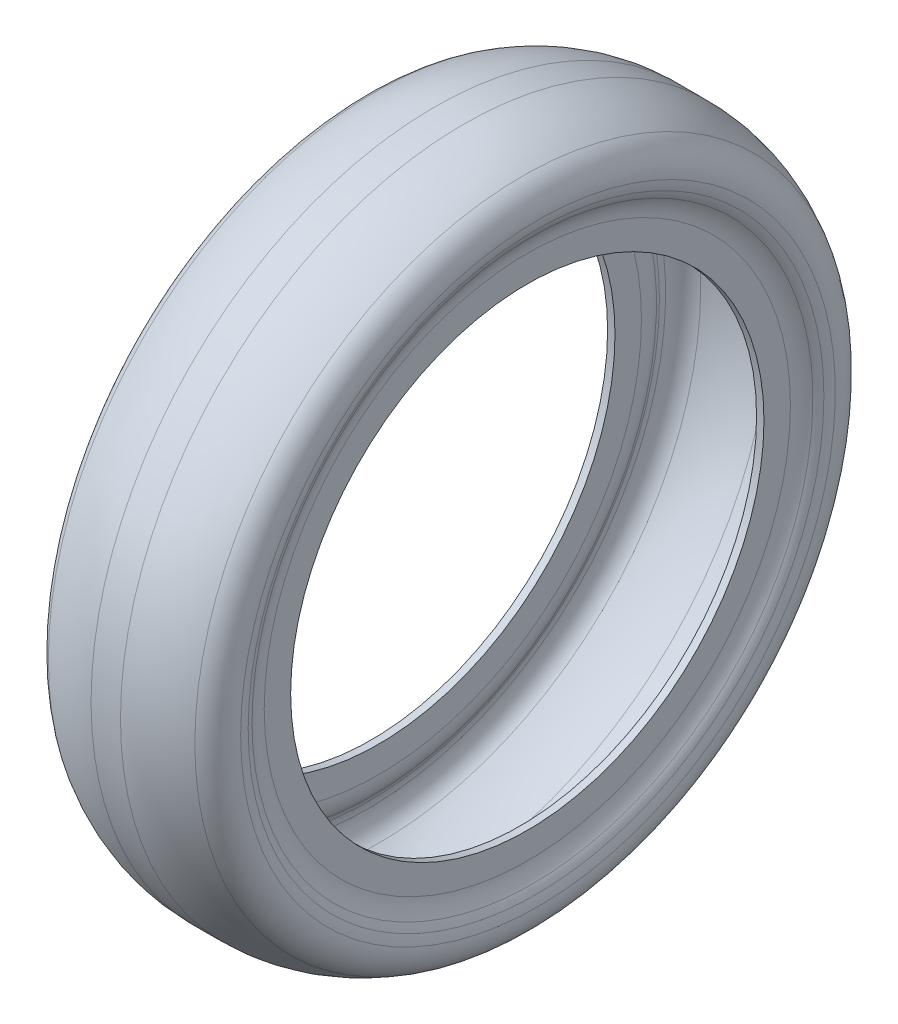
ISO-10303-21;
HEADER;
FILE_DESCRIPTION(('STEP AP214'),'2;1');
FILE_NAME('part.step','',(''),(''),'','','');
FILE_SCHEMA(('AUTOMOTIVE_DESIGN { 1 0 10303 214 1 1 1 1 }'));
ENDSEC;
DATA;
#1=APPLICATION_CONTEXT('core data for automotive mechanical design processes');
#2=APPLICATION_PROTOCOL_DEFINITION('international standard','automotive_design',2000,#1);
#3=PRODUCT_CONTEXT('',#1,'mechanical');
#4=PRODUCT('Part','Part','',(#3));
#5=PRODUCT_RELATED_PRODUCT_CATEGORY('part','',(#4));
#6=PRODUCT_DEFINITION_FORMATION('','',#4);
#7=PRODUCT_DEFINITION_CONTEXT('part definition',#1,'design');
#8=PRODUCT_DEFINITION('design','',#6,#7);
#9=PRODUCT_DEFINITION_SHAPE('','',#8);
#10=(LENGTH_UNIT() NAMED_UNIT(*) SI_UNIT(.MILLI.,.METRE.));
#11=(NAMED_UNIT(*) PLANE_ANGLE_UNIT() SI_UNIT($,.RADIAN.));
#12=(NAMED_UNIT(*) SI_UNIT($,.STERADIAN.) SOLID_ANGLE_UNIT());
#13=UNCERTAINTY_MEASURE_WITH_UNIT(LENGTH_MEASURE(1.E-05),#10,'distance_accuracy_value','');
#14=(GEOMETRIC_REPRESENTATION_CONTEXT(3) GLOBAL_UNCERTAINTY_ASSIGNED_CONTEXT((#13)) GLOBAL_UNIT_ASSIGNED_CONTEXT((#10,
#11,#12)) REPRESENTATION_CONTEXT('',''));
#15=CARTESIAN_POINT('',(0.,0.,0.));
#16=DIRECTION('',(0.,0.,1.));
#17=DIRECTION('',(1.,0.,0.));
#18=AXIS2_PLACEMENT_3D('',#15,#16,#17);
#19=CARTESIAN_POINT('',(47.1399999999994,224.,0.));
#20=DIRECTION('',(1.,0.,0.));
#21=DIRECTION('',(0.,0.,-1.));
#22=AXIS2_PLACEMENT_3D('',#19,#20,#21);
#23=PLANE('',#22);
#24=CARTESIAN_POINT('',(47.1399999999994,0.,0.));
#25=DIRECTION('',(-1.,0.,0.));
#26=DIRECTION('',(0.,0.,1.));
#27=AXIS2_PLACEMENT_3D('',#24,#25,#26);
#28=CIRCLE('',#27,224.);
#29=CARTESIAN_POINT('',(47.1399999999994,0.,224.));
#30=VERTEX_POINT('',#29);
#31=EDGE_CURVE('E10',#30,#30,#28,.T.);
#32=ORIENTED_EDGE('',*,*,#31,.F.);
#33=EDGE_LOOP('',(#32));
#34=FACE_BOUND('',#33,.T.);
#35=CARTESIAN_POINT('',(47.1399999999994,0.,0.));
#36=DIRECTION('',(-1.,0.,0.));
#37=DIRECTION('',(0.,0.,1.));
#38=AXIS2_PLACEMENT_3D('',#35,#36,#37);
#39=CIRCLE('',#38,249.04926879619);
#40=CARTESIAN_POINT('',(47.1399999999994,0.,249.04926879619));
#41=VERTEX_POINT('',#40);
#42=EDGE_CURVE('E119',#41,#41,#39,.T.);
#43=ORIENTED_EDGE('',*,*,#42,.T.);
#44=EDGE_LOOP('',(#43));
#45=FACE_BOUND('',#44,.T.);
#46=ADVANCED_FACE('F31',(#34,#45),#23,.F.);
#47=CARTESIAN_POINT('',(130.136206896551,0.,0.));
#48=DIRECTION('',(-1.,0.,0.));
#49=DIRECTION('',(0.,0.,1.));
#50=AXIS2_PLACEMENT_3D('',#47,#48,#49);
#51=CYLINDRICAL_SURFACE('',#50,224.);
#52=ORIENTED_EDGE('',*,*,#31,.T.);
#53=EDGE_LOOP('',(#52));
#54=FACE_BOUND('',#53,.T.);
#55=CARTESIAN_POINT('',(54.1399999999994,0.,0.));
#56=DIRECTION('',(-1.,0.,0.));
#57=DIRECTION('',(0.,0.,1.));
#58=AXIS2_PLACEMENT_3D('',#55,#56,#57);
#59=CIRCLE('',#58,224.);
#60=CARTESIAN_POINT('',(54.1399999999994,0.,224.));
#61=VERTEX_POINT('',#60);
#62=EDGE_CURVE('E37',#61,#61,#59,.T.);
#63=ORIENTED_EDGE('',*,*,#62,.F.);
#64=EDGE_LOOP('',(#63));
#65=FACE_BOUND('',#64,.T.);
#66=ADVANCED_FACE('F208',(#54,#65),#51,.F.);
#67=CARTESIAN_POINT('',(54.1399999999994,224.,0.));
#68=DIRECTION('',(1.,0.,0.));
#69=DIRECTION('',(0.,0.,-1.));
#70=AXIS2_PLACEMENT_3D('',#67,#68,#69);
#71=PLANE('',#70);
#72=ORIENTED_EDGE('',*,*,#62,.T.);
#73=EDGE_LOOP('',(#72));
#74=FACE_BOUND('',#73,.T.);
#75=CARTESIAN_POINT('',(54.1399999999994,0.,0.));
#76=DIRECTION('',(-1.,0.,0.));
#77=DIRECTION('',(0.,0.,1.));
#78=AXIS2_PLACEMENT_3D('',#75,#76,#77);
#79=CIRCLE('',#78,249.04926879619);
#80=CARTESIAN_POINT('',(54.1399999999994,0.,249.04926879619));
#81=VERTEX_POINT('',#80);
#82=EDGE_CURVE('E41',#81,#81,#79,.T.);
#83=ORIENTED_EDGE('',*,*,#82,.F.);
#84=EDGE_LOOP('',(#83));
#85=FACE_BOUND('',#84,.T.);
#86=ADVANCED_FACE('F213',(#74,#85),#71,.T.);
#87=CARTESIAN_POINT('',(17.1399999999994,0.,0.));
#88=DIRECTION('',(-1.,0.,0.));
#89=DIRECTION('',(0.,0.,1.));
#90=AXIS2_PLACEMENT_3D('',#87,#88,#89);
#91=TOROIDAL_SURFACE('',#90,249.04926879619,37.);
#92=ORIENTED_EDGE('',*,*,#82,.T.);
#93=EDGE_LOOP('',(#92));
#94=FACE_BOUND('',#93,.T.);
#95=CARTESIAN_POINT('',(48.1154632074925,0.,0.));
#96=DIRECTION('',(-1.,0.,0.));
#97=DIRECTION('',(0.,0.,1.));
#98=AXIS2_PLACEMENT_3D('',#95,#96,#97);
#99=CIRCLE('',#98,269.285886079749);
#100=CARTESIAN_POINT('',(48.1154632074925,0.,269.285886079749));
#101=VERTEX_POINT('',#100);
#102=EDGE_CURVE('E45',#101,#101,#99,.T.);
#103=ORIENTED_EDGE('',*,*,#102,.F.);
#104=EDGE_LOOP('',(#103));
#105=FACE_BOUND('',#104,.T.);
#106=ADVANCED_FACE('F217',(#94,#105),#91,.T.);
#107=CARTESIAN_POINT('',(67.3704808770153,0.,0.));
#108=DIRECTION('',(-1.,0.,0.));
#109=DIRECTION('',(0.,0.,1.));
#110=AXIS2_PLACEMENT_3D('',#107,#108,#109);
#111=TOROIDAL_SURFACE('',#110,281.865404931691,23.);
#112=ORIENTED_EDGE('',*,*,#102,.T.);
#113=EDGE_LOOP('',(#112));
#114=FACE_BOUND('',#113,.T.);
#115=CARTESIAN_POINT('',(45.529644817505,0.,0.));
#116=DIRECTION('',(-1.,0.,0.));
#117=DIRECTION('',(0.,0.,1.));
#118=AXIS2_PLACEMENT_3D('',#115,#116,#117);
#119=CIRCLE('',#118,274.65583627458);
#120=CARTESIAN_POINT('',(45.529644817505,0.,274.65583627458));
#121=VERTEX_POINT('',#120);
#122=EDGE_CURVE('E50',#121,#121,#119,.T.);
#123=ORIENTED_EDGE('',*,*,#122,.F.);
#124=EDGE_LOOP('',(#123));
#125=FACE_BOUND('',#124,.T.);
#126=ADVANCED_FACE('F223',(#114,#125),#111,.F.);
#127=CARTESIAN_POINT('',(76.8664965550632,0.,0.));
#128=DIRECTION('',(-1.,0.,0.));
#129=DIRECTION('',(0.,0.,1.));
#130=AXIS2_PLACEMENT_3D('',#127,#128,#129);
#131=TOROIDAL_SURFACE('',#130,285.,33.);
#132=ORIENTED_EDGE('',*,*,#122,.T.);
#133=EDGE_LOOP('',(#132));
#134=FACE_BOUND('',#133,.T.);
#135=CARTESIAN_POINT('',(43.9982920808038,0.,0.));
#136=DIRECTION('',(-1.,0.,0.));
#137=DIRECTION('',(0.,0.,1.));
#138=AXIS2_PLACEMENT_3D('',#135,#136,#137);
#139=CIRCLE('',#138,282.053623473099);
#140=CARTESIAN_POINT('',(43.9982920808038,0.,282.053623473099));
#141=VERTEX_POINT('',#140);
#142=EDGE_CURVE('E53',#141,#141,#139,.T.);
#143=ORIENTED_EDGE('',*,*,#142,.F.);
#144=EDGE_LOOP('',(#143));
#145=FACE_BOUND('',#144,.T.);
#146=ADVANCED_FACE('F227',(#134,#145),#131,.F.);
#147=CARTESIAN_POINT('',(66.9064345931664,0.,0.));
#148=DIRECTION('',(-1.,0.,0.));
#149=DIRECTION('',(0.,0.,1.));
#150=AXIS2_PLACEMENT_3D('',#147,#148,#149);
#151=TOROIDAL_SURFACE('',#150,284.107158628212,23.);
#152=ORIENTED_EDGE('',*,*,#142,.T.);
#153=EDGE_LOOP('',(#152));
#154=FACE_BOUND('',#153,.T.);
#155=CARTESIAN_POINT('',(55.3197899960228,0.,0.));
#156=DIRECTION('',(-1.,0.,0.));
#157=DIRECTION('',(0.,0.,1.));
#158=AXIS2_PLACEMENT_3D('',#155,#156,#157);
#159=CIRCLE('',#158,303.975466733823);
#160=CARTESIAN_POINT('',(55.3197899960228,0.,303.975466733823));
#161=VERTEX_POINT('',#160);
#162=EDGE_CURVE('E56',#161,#161,#159,.T.);
#163=ORIENTED_EDGE('',*,*,#162,.F.);
#164=EDGE_LOOP('',(#163));
#165=FACE_BOUND('',#164,.T.);
#166=ADVANCED_FACE('F231',(#154,#165),#151,.F.);
#167=CARTESIAN_POINT('',(107.20780710497,0.,0.));
#168=DIRECTION('',(-1.,0.,0.));
#169=DIRECTION('',(0.,0.,1.));
#170=AXIS2_PLACEMENT_3D('',#167,#168,#169);
#171=TOROIDAL_SURFACE('',#170,215.,103.);
#172=ORIENTED_EDGE('',*,*,#162,.T.);
#173=EDGE_LOOP('',(#172));
#174=FACE_BOUND('',#173,.T.);
#175=CARTESIAN_POINT('',(107.20780710497,0.,0.));
#176=DIRECTION('',(-1.,0.,0.));
#177=DIRECTION('',(0.,0.,1.));
#178=AXIS2_PLACEMENT_3D('',#175,#176,#177);
#179=CIRCLE('',#178,318.);
#180=CARTESIAN_POINT('',(107.20780710497,0.,318.));
#181=VERTEX_POINT('',#180);
#182=EDGE_CURVE('E59',#181,#181,#179,.T.);
#183=ORIENTED_EDGE('',*,*,#182,.F.);
#184=EDGE_LOOP('',(#183));
#185=FACE_BOUND('',#184,.T.);
#186=ADVANCED_FACE('F235',(#174,#185),#171,.F.);
#187=CARTESIAN_POINT('',(130.136206896551,0.,0.));
#188=DIRECTION('',(-1.,0.,0.));
#189=DIRECTION('',(0.,0.,1.));
#190=AXIS2_PLACEMENT_3D('',#187,#188,#189);
#191=CYLINDRICAL_SURFACE('',#190,318.);
#192=ORIENTED_EDGE('',*,*,#182,.T.);
#193=EDGE_LOOP('',(#192));
#194=FACE_BOUND('',#193,.T.);
#195=CARTESIAN_POINT('',(135.072192895031,0.,0.));
#196=DIRECTION('',(-1.,0.,0.));
#197=DIRECTION('',(0.,0.,1.));
#198=AXIS2_PLACEMENT_3D('',#195,#196,#197);
#199=CIRCLE('',#198,318.);
#200=CARTESIAN_POINT('',(135.072192895031,0.,318.));
#201=VERTEX_POINT('',#200);
#202=EDGE_CURVE('E62',#201,#201,#199,.T.);
#203=ORIENTED_EDGE('',*,*,#202,.F.);
#204=EDGE_LOOP('',(#203));
#205=FACE_BOUND('',#204,.T.);
#206=ADVANCED_FACE('F239',(#194,#205),#191,.F.);
#207=CARTESIAN_POINT('',(135.072192895031,0.,0.));
#208=DIRECTION('',(-1.,0.,0.));
#209=DIRECTION('',(0.,0.,1.));
#210=AXIS2_PLACEMENT_3D('',#207,#208,#209);
#211=TOROIDAL_SURFACE('',#210,215.,103.);
#212=ORIENTED_EDGE('',*,*,#202,.T.);
#213=EDGE_LOOP('',(#212));
#214=FACE_BOUND('',#213,.T.);
#215=CARTESIAN_POINT('',(186.960210003978,0.,0.));
#216=DIRECTION('',(-1.,0.,0.));
#217=DIRECTION('',(0.,0.,1.));
#218=AXIS2_PLACEMENT_3D('',#215,#216,#217);
#219=CIRCLE('',#218,303.975466733823);
#220=CARTESIAN_POINT('',(186.960210003978,0.,303.975466733823));
#221=VERTEX_POINT('',#220);
#222=EDGE_CURVE('E65',#221,#221,#219,.T.);
#223=ORIENTED_EDGE('',*,*,#222,.F.);
#224=EDGE_LOOP('',(#223));
#225=FACE_BOUND('',#224,.T.);
#226=ADVANCED_FACE('F243',(#214,#225),#211,.F.);
#227=CARTESIAN_POINT('',(175.373565406835,0.,0.));
#228=DIRECTION('',(-1.,0.,0.));
#229=DIRECTION('',(0.,0.,1.));
#230=AXIS2_PLACEMENT_3D('',#227,#228,#229);
#231=TOROIDAL_SURFACE('',#230,284.107158628212,23.);
#232=ORIENTED_EDGE('',*,*,#222,.T.);
#233=EDGE_LOOP('',(#232));
#234=FACE_BOUND('',#233,.T.);
#235=CARTESIAN_POINT('',(198.281707919197,0.,0.));
#236=DIRECTION('',(-1.,0.,0.));
#237=DIRECTION('',(0.,0.,1.));
#238=AXIS2_PLACEMENT_3D('',#235,#236,#237);
#239=CIRCLE('',#238,282.053623473099);
#240=CARTESIAN_POINT('',(198.281707919197,0.,282.053623473099));
#241=VERTEX_POINT('',#240);
#242=EDGE_CURVE('E68',#241,#241,#239,.T.);
#243=ORIENTED_EDGE('',*,*,#242,.F.);
#244=EDGE_LOOP('',(#243));
#245=FACE_BOUND('',#244,.T.);
#246=ADVANCED_FACE('F247',(#234,#245),#231,.F.);
#247=CARTESIAN_POINT('',(165.413503444938,0.,0.));
#248=DIRECTION('',(-1.,0.,0.));
#249=DIRECTION('',(0.,0.,1.));
#250=AXIS2_PLACEMENT_3D('',#247,#248,#249);
#251=TOROIDAL_SURFACE('',#250,285.,33.);
#252=ORIENTED_EDGE('',*,*,#242,.T.);
#253=EDGE_LOOP('',(#252));
#254=FACE_BOUND('',#253,.T.);
#255=CARTESIAN_POINT('',(196.750355182496,0.,0.));
#256=DIRECTION('',(-1.,0.,0.));
#257=DIRECTION('',(0.,0.,1.));
#258=AXIS2_PLACEMENT_3D('',#255,#256,#257);
#259=CIRCLE('',#258,274.65583627458);
#260=CARTESIAN_POINT('',(196.750355182496,0.,274.65583627458));
#261=VERTEX_POINT('',#260);
#262=EDGE_CURVE('E71',#261,#261,#259,.T.);
#263=ORIENTED_EDGE('',*,*,#262,.F.);
#264=EDGE_LOOP('',(#263));
#265=FACE_BOUND('',#264,.T.);
#266=ADVANCED_FACE('F251',(#254,#265),#251,.F.);
#267=CARTESIAN_POINT('',(174.909519122986,0.,0.));
#268=DIRECTION('',(-1.,0.,0.));
#269=DIRECTION('',(0.,0.,1.));
#270=AXIS2_PLACEMENT_3D('',#267,#268,#269);
#271=TOROIDAL_SURFACE('',#270,281.865404931691,23.);
#272=ORIENTED_EDGE('',*,*,#262,.T.);
#273=EDGE_LOOP('',(#272));
#274=FACE_BOUND('',#273,.T.);
#275=CARTESIAN_POINT('',(194.164536792509,0.,0.));
#276=DIRECTION('',(-1.,0.,0.));
#277=DIRECTION('',(0.,0.,1.));
#278=AXIS2_PLACEMENT_3D('',#275,#276,#277);
#279=CIRCLE('',#278,269.285886079749);
#280=CARTESIAN_POINT('',(194.164536792509,0.,269.285886079749));
#281=VERTEX_POINT('',#280);
#282=EDGE_CURVE('E74',#281,#281,#279,.T.);
#283=ORIENTED_EDGE('',*,*,#282,.F.);
#284=EDGE_LOOP('',(#283));
#285=FACE_BOUND('',#284,.T.);
#286=ADVANCED_FACE('F255',(#274,#285),#271,.F.);
#287=CARTESIAN_POINT('',(225.140000000002,0.,0.));
#288=DIRECTION('',(-1.,0.,0.));
#289=DIRECTION('',(0.,0.,1.));
#290=AXIS2_PLACEMENT_3D('',#287,#288,#289);
#291=TOROIDAL_SURFACE('',#290,249.04926879619,37.);
#292=ORIENTED_EDGE('',*,*,#282,.T.);
#293=EDGE_LOOP('',(#292));
#294=FACE_BOUND('',#293,.T.);
#295=CARTESIAN_POINT('',(188.140000000002,0.,0.));
#296=DIRECTION('',(-1.,0.,0.));
#297=DIRECTION('',(0.,0.,1.));
#298=AXIS2_PLACEMENT_3D('',#295,#296,#297);
#299=CIRCLE('',#298,249.04926879619);
#300=CARTESIAN_POINT('',(188.140000000002,0.,249.04926879619));
#301=VERTEX_POINT('',#300);
#302=EDGE_CURVE('E77',#301,#301,#299,.T.);
#303=ORIENTED_EDGE('',*,*,#302,.F.);
#304=EDGE_LOOP('',(#303));
#305=FACE_BOUND('',#304,.T.);
#306=ADVANCED_FACE('F204',(#294,#305),#291,.T.);
#307=CARTESIAN_POINT('',(188.140000000002,224.,0.));
#308=DIRECTION('',(-1.,0.,0.));
#309=DIRECTION('',(0.,0.,1.));
#310=AXIS2_PLACEMENT_3D('',#307,#308,#309);
#311=PLANE('',#310);
#312=ORIENTED_EDGE('',*,*,#302,.T.);
#313=EDGE_LOOP('',(#312));
#314=FACE_BOUND('',#313,.T.);
#315=CARTESIAN_POINT('',(188.140000000002,0.,0.));
#316=DIRECTION('',(-1.,0.,0.));
#317=DIRECTION('',(0.,0.,1.));
#318=AXIS2_PLACEMENT_3D('',#315,#316,#317);
#319=CIRCLE('',#318,224.);
#320=CARTESIAN_POINT('',(188.140000000002,0.,224.));
#321=VERTEX_POINT('',#320);
#322=EDGE_CURVE('E80',#321,#321,#319,.T.);
#323=ORIENTED_EDGE('',*,*,#322,.F.);
#324=EDGE_LOOP('',(#323));
#325=FACE_BOUND('',#324,.T.);
#326=ADVANCED_FACE('F198',(#314,#325),#311,.T.);
#327=CARTESIAN_POINT('',(130.136206896551,0.,0.));
#328=DIRECTION('',(-1.,0.,0.));
#329=DIRECTION('',(0.,0.,1.));
#330=AXIS2_PLACEMENT_3D('',#327,#328,#329);
#331=CYLINDRICAL_SURFACE('',#330,224.);
#332=ORIENTED_EDGE('',*,*,#322,.T.);
#333=EDGE_LOOP('',(#332));
#334=FACE_BOUND('',#333,.T.);
#335=CARTESIAN_POINT('',(195.140000000002,0.,0.));
#336=DIRECTION('',(-1.,0.,0.));
#337=DIRECTION('',(0.,0.,1.));
#338=AXIS2_PLACEMENT_3D('',#335,#336,#337);
#339=CIRCLE('',#338,224.);
#340=CARTESIAN_POINT('',(195.140000000002,0.,224.));
#341=VERTEX_POINT('',#340);
#342=EDGE_CURVE('E83',#341,#341,#339,.T.);
#343=ORIENTED_EDGE('',*,*,#342,.F.);
#344=EDGE_LOOP('',(#343));
#345=FACE_BOUND('',#344,.T.);
#346=ADVANCED_FACE('F193',(#334,#345),#331,.F.);
#347=CARTESIAN_POINT('',(195.140000000002,224.,0.));
#348=DIRECTION('',(-1.,0.,0.));
#349=DIRECTION('',(0.,0.,1.));
#350=AXIS2_PLACEMENT_3D('',#347,#348,#349);
#351=PLANE('',#350);
#352=CARTESIAN_POINT('',(195.140000000002,0.,0.));
#353=DIRECTION('',(-1.,0.,0.));
#354=DIRECTION('',(0.,0.,1.));
#355=AXIS2_PLACEMENT_3D('',#352,#353,#354);
#356=CIRCLE('',#355,249.04926879619);
#357=CARTESIAN_POINT('',(195.140000000002,0.,249.04926879619));
#358=VERTEX_POINT('',#357);
#359=EDGE_CURVE('E86',#358,#358,#356,.T.);
#360=ORIENTED_EDGE('',*,*,#359,.F.);
#361=EDGE_LOOP('',(#360));
#362=FACE_BOUND('',#361,.T.);
#363=ORIENTED_EDGE('',*,*,#342,.T.);
#364=EDGE_LOOP('',(#363));
#365=FACE_BOUND('',#364,.T.);
#366=ADVANCED_FACE('F187',(#362,#365),#351,.F.);
#367=CARTESIAN_POINT('',(225.140000000002,0.,0.));
#368=DIRECTION('',(-1.,0.,0.));
#369=DIRECTION('',(0.,0.,1.));
#370=AXIS2_PLACEMENT_3D('',#367,#368,#369);
#371=TOROIDAL_SURFACE('',#370,249.04926879619,30.);
#372=CARTESIAN_POINT('',(200.024759561494,0.,0.));
#373=DIRECTION('',(-1.,0.,0.));
#374=DIRECTION('',(0.,0.,1.));
#375=AXIS2_PLACEMENT_3D('',#372,#373,#374);
#376=CIRCLE('',#375,265.45733686394);
#377=CARTESIAN_POINT('',(200.024759561494,0.,265.45733686394));
#378=VERTEX_POINT('',#377);
#379=EDGE_CURVE('E89',#378,#378,#376,.T.);
#380=ORIENTED_EDGE('',*,*,#379,.F.);
#381=EDGE_LOOP('',(#380));
#382=FACE_BOUND('',#381,.T.);
#383=ORIENTED_EDGE('',*,*,#359,.T.);
#384=EDGE_LOOP('',(#383));
#385=FACE_BOUND('',#384,.T.);
#386=ADVANCED_FACE('F181',(#382,#385),#371,.F.);
#387=CARTESIAN_POINT('',(174.909519122986,0.,0.));
#388=DIRECTION('',(-1.,0.,0.));
#389=DIRECTION('',(0.,0.,1.));
#390=AXIS2_PLACEMENT_3D('',#387,#388,#389);
#391=TOROIDAL_SURFACE('',#390,281.865404931691,30.);
#392=CARTESIAN_POINT('',(203.39756615713,0.,0.));
#393=DIRECTION('',(-1.,0.,0.));
#394=DIRECTION('',(0.,0.,1.));
#395=AXIS2_PLACEMENT_3D('',#392,#393,#394);
#396=CIRCLE('',#395,272.461619726764);
#397=CARTESIAN_POINT('',(203.39756615713,0.,272.461619726764));
#398=VERTEX_POINT('',#397);
#399=EDGE_CURVE('E92',#398,#398,#396,.T.);
#400=ORIENTED_EDGE('',*,*,#399,.F.);
#401=EDGE_LOOP('',(#400));
#402=FACE_BOUND('',#401,.T.);
#403=ORIENTED_EDGE('',*,*,#379,.T.);
#404=EDGE_LOOP('',(#403));
#405=FACE_BOUND('',#404,.T.);
#406=ADVANCED_FACE('F175',(#402,#405),#391,.T.);
#407=CARTESIAN_POINT('',(165.413503444938,0.,0.));
#408=DIRECTION('',(-1.,0.,0.));
#409=DIRECTION('',(0.,0.,1.));
#410=AXIS2_PLACEMENT_3D('',#407,#408,#409);
#411=TOROIDAL_SURFACE('',#410,285.,40.);
#412=CARTESIAN_POINT('',(205.253751292525,0.,0.));
#413=DIRECTION('',(-1.,0.,0.));
#414=DIRECTION('',(0.,0.,1.));
#415=AXIS2_PLACEMENT_3D('',#412,#413,#414);
#416=CIRCLE('',#415,281.428634512847);
#417=CARTESIAN_POINT('',(205.253751292525,0.,281.428634512847));
#418=VERTEX_POINT('',#417);
#419=EDGE_CURVE('E95',#418,#418,#416,.T.);
#420=ORIENTED_EDGE('',*,*,#419,.F.);
#421=EDGE_LOOP('',(#420));
#422=FACE_BOUND('',#421,.T.);
#423=ORIENTED_EDGE('',*,*,#399,.T.);
#424=EDGE_LOOP('',(#423));
#425=FACE_BOUND('',#424,.T.);
#426=ADVANCED_FACE('F169',(#422,#425),#411,.T.);
#427=CARTESIAN_POINT('',(175.373565406835,0.,0.));
#428=DIRECTION('',(-1.,0.,0.));
#429=DIRECTION('',(0.,0.,1.));
#430=AXIS2_PLACEMENT_3D('',#427,#428,#429);
#431=TOROIDAL_SURFACE('',#430,284.107158628212,30.);
#432=CARTESIAN_POINT('',(190.486580098761,0.,0.));
#433=DIRECTION('',(-1.,0.,0.));
#434=DIRECTION('',(0.,0.,1.));
#435=AXIS2_PLACEMENT_3D('',#432,#433,#434);
#436=CIRCLE('',#435,310.022343113791);
#437=CARTESIAN_POINT('',(190.486580098761,0.,310.022343113791));
#438=VERTEX_POINT('',#437);
#439=EDGE_CURVE('E98',#438,#438,#436,.T.);
#440=ORIENTED_EDGE('',*,*,#439,.F.);
#441=EDGE_LOOP('',(#440));
#442=FACE_BOUND('',#441,.T.);
#443=ORIENTED_EDGE('',*,*,#419,.T.);
#444=EDGE_LOOP('',(#443));
#445=FACE_BOUND('',#444,.T.);
#446=ADVANCED_FACE('F163',(#442,#445),#431,.T.);
#447=CARTESIAN_POINT('',(135.072192895031,0.,0.));
#448=DIRECTION('',(-1.,0.,0.));
#449=DIRECTION('',(0.,0.,1.));
#450=AXIS2_PLACEMENT_3D('',#447,#448,#449);
#451=TOROIDAL_SURFACE('',#450,215.,110.);
#452=CARTESIAN_POINT('',(135.072192895031,0.,0.));
#453=DIRECTION('',(-1.,0.,0.));
#454=DIRECTION('',(0.,0.,1.));
#455=AXIS2_PLACEMENT_3D('',#452,#453,#454);
#456=CIRCLE('',#455,325.);
#457=CARTESIAN_POINT('',(135.072192895031,0.,325.));
#458=VERTEX_POINT('',#457);
#459=EDGE_CURVE('E101',#458,#458,#456,.T.);
#460=ORIENTED_EDGE('',*,*,#459,.F.);
#461=EDGE_LOOP('',(#460));
#462=FACE_BOUND('',#461,.T.);
#463=ORIENTED_EDGE('',*,*,#439,.T.);
#464=EDGE_LOOP('',(#463));
#465=FACE_BOUND('',#464,.T.);
#466=ADVANCED_FACE('F157',(#462,#465),#451,.T.);
#467=CARTESIAN_POINT('',(130.136206896551,0.,0.));
#468=DIRECTION('',(-1.,0.,0.));
#469=DIRECTION('',(0.,0.,1.));
#470=AXIS2_PLACEMENT_3D('',#467,#468,#469);
#471=CYLINDRICAL_SURFACE('',#470,325.);
#472=CARTESIAN_POINT('',(107.20780710497,0.,0.));
#473=DIRECTION('',(-1.,0.,0.));
#474=DIRECTION('',(0.,0.,1.));
#475=AXIS2_PLACEMENT_3D('',#472,#473,#474);
#476=CIRCLE('',#475,325.);
#477=CARTESIAN_POINT('',(107.20780710497,0.,325.));
#478=VERTEX_POINT('',#477);
#479=EDGE_CURVE('E104',#478,#478,#476,.T.);
#480=ORIENTED_EDGE('',*,*,#479,.F.);
#481=EDGE_LOOP('',(#480));
#482=FACE_BOUND('',#481,.T.);
#483=ORIENTED_EDGE('',*,*,#459,.T.);
#484=EDGE_LOOP('',(#483));
#485=FACE_BOUND('',#484,.T.);
#486=ADVANCED_FACE('F151',(#482,#485),#471,.T.);
#487=CARTESIAN_POINT('',(107.20780710497,0.,0.));
#488=DIRECTION('',(-1.,0.,0.));
#489=DIRECTION('',(0.,0.,1.));
#490=AXIS2_PLACEMENT_3D('',#487,#488,#489);
#491=TOROIDAL_SURFACE('',#490,215.,110.);
#492=CARTESIAN_POINT('',(51.7934199012399,0.,0.));
#493=DIRECTION('',(-1.,0.,0.));
#494=DIRECTION('',(0.,0.,1.));
#495=AXIS2_PLACEMENT_3D('',#492,#493,#494);
#496=CIRCLE('',#495,310.022343113791);
#497=CARTESIAN_POINT('',(51.7934199012399,0.,310.022343113791));
#498=VERTEX_POINT('',#497);
#499=EDGE_CURVE('E107',#498,#498,#496,.T.);
#500=ORIENTED_EDGE('',*,*,#499,.F.);
#501=EDGE_LOOP('',(#500));
#502=FACE_BOUND('',#501,.T.);
#503=ORIENTED_EDGE('',*,*,#479,.T.);
#504=EDGE_LOOP('',(#503));
#505=FACE_BOUND('',#504,.T.);
#506=ADVANCED_FACE('F145',(#502,#505),#491,.T.);
#507=CARTESIAN_POINT('',(66.9064345931664,0.,0.));
#508=DIRECTION('',(-1.,0.,0.));
#509=DIRECTION('',(0.,0.,1.));
#510=AXIS2_PLACEMENT_3D('',#507,#508,#509);
#511=TOROIDAL_SURFACE('',#510,284.107158628212,30.);
#512=CARTESIAN_POINT('',(37.0262487074761,0.,0.));
#513=DIRECTION('',(-1.,0.,0.));
#514=DIRECTION('',(0.,0.,1.));
#515=AXIS2_PLACEMENT_3D('',#512,#513,#514);
#516=CIRCLE('',#515,281.428634512847);
#517=CARTESIAN_POINT('',(37.0262487074761,0.,281.428634512847));
#518=VERTEX_POINT('',#517);
#519=EDGE_CURVE('E110',#518,#518,#516,.T.);
#520=ORIENTED_EDGE('',*,*,#519,.F.);
#521=EDGE_LOOP('',(#520));
#522=FACE_BOUND('',#521,.T.);
#523=ORIENTED_EDGE('',*,*,#499,.T.);
#524=EDGE_LOOP('',(#523));
#525=FACE_BOUND('',#524,.T.);
#526=ADVANCED_FACE('F139',(#522,#525),#511,.T.);
#527=CARTESIAN_POINT('',(76.8664965550632,0.,0.));
#528=DIRECTION('',(-1.,0.,0.));
#529=DIRECTION('',(0.,0.,1.));
#530=AXIS2_PLACEMENT_3D('',#527,#528,#529);
#531=TOROIDAL_SURFACE('',#530,285.,40.);
#532=CARTESIAN_POINT('',(38.8824338428715,0.,0.));
#533=DIRECTION('',(-1.,0.,0.));
#534=DIRECTION('',(0.,0.,1.));
#535=AXIS2_PLACEMENT_3D('',#532,#533,#534);
#536=CIRCLE('',#535,272.461619726764);
#537=CARTESIAN_POINT('',(38.8824338428715,0.,272.461619726764));
#538=VERTEX_POINT('',#537);
#539=EDGE_CURVE('E113',#538,#538,#536,.T.);
#540=ORIENTED_EDGE('',*,*,#539,.F.);
#541=EDGE_LOOP('',(#540));
#542=FACE_BOUND('',#541,.T.);
#543=ORIENTED_EDGE('',*,*,#519,.T.);
#544=EDGE_LOOP('',(#543));
#545=FACE_BOUND('',#544,.T.);
#546=ADVANCED_FACE('F133',(#542,#545),#531,.T.);
#547=CARTESIAN_POINT('',(67.3704808770153,0.,0.));
#548=DIRECTION('',(-1.,0.,0.));
#549=DIRECTION('',(0.,0.,1.));
#550=AXIS2_PLACEMENT_3D('',#547,#548,#549);
#551=TOROIDAL_SURFACE('',#550,281.865404931691,30.);
#552=CARTESIAN_POINT('',(42.2552404385074,0.,0.));
#553=DIRECTION('',(-1.,0.,0.));
#554=DIRECTION('',(0.,0.,1.));
#555=AXIS2_PLACEMENT_3D('',#552,#553,#554);
#556=CIRCLE('',#555,265.45733686394);
#557=CARTESIAN_POINT('',(42.2552404385074,0.,265.45733686394));
#558=VERTEX_POINT('',#557);
#559=EDGE_CURVE('E116',#558,#558,#556,.T.);
#560=ORIENTED_EDGE('',*,*,#559,.F.);
#561=EDGE_LOOP('',(#560));
#562=FACE_BOUND('',#561,.T.);
#563=ORIENTED_EDGE('',*,*,#539,.T.);
#564=EDGE_LOOP('',(#563));
#565=FACE_BOUND('',#564,.T.);
#566=ADVANCED_FACE('F127',(#562,#565),#551,.T.);
#567=CARTESIAN_POINT('',(17.1399999999994,0.,0.));
#568=DIRECTION('',(-1.,0.,0.));
#569=DIRECTION('',(0.,0.,1.));
#570=AXIS2_PLACEMENT_3D('',#567,#568,#569);
#571=TOROIDAL_SURFACE('',#570,249.04926879619,30.);
#572=ORIENTED_EDGE('',*,*,#42,.F.);
#573=EDGE_LOOP('',(#572));
#574=FACE_BOUND('',#573,.T.);
#575=ORIENTED_EDGE('',*,*,#559,.T.);
#576=EDGE_LOOP('',(#575));
#577=FACE_BOUND('',#576,.T.);
#578=ADVANCED_FACE('F124',(#574,#577),#571,.F.);
#579=CLOSED_SHELL('',(#46,#66,#86,#106,#126,#146,#166,#186,#206,#226,#246,#266,#286,#306,#326,
#346,#366,#386,#406,#426,#446,#466,#486,#506,#526,#546,#566,#578));
#580=MANIFOLD_SOLID_BREP('B2',#579);
#581=ADVANCED_BREP_SHAPE_REPRESENTATION('',(#18,#580),#14);
#582=SHAPE_DEFINITION_REPRESENTATION(#9,#581);
ENDSEC;
END-ISO-10303-21;
